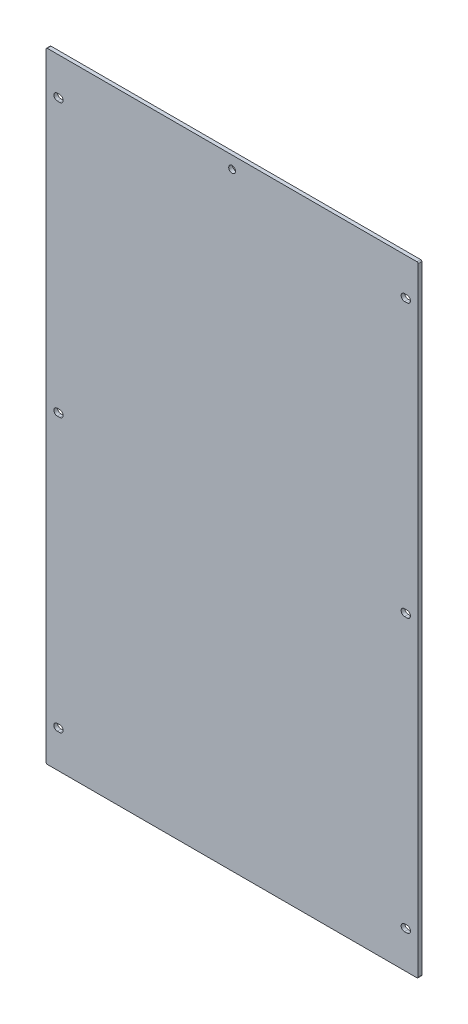
ISO-10303-21;
HEADER;
FILE_DESCRIPTION(('STEP AP214'),'2;1');
FILE_NAME('part.step','',(''),(''),'','','');
FILE_SCHEMA(('AUTOMOTIVE_DESIGN { 1 0 10303 214 1 1 1 1 }'));
ENDSEC;
DATA;
#1=APPLICATION_CONTEXT('core data for automotive mechanical design processes');
#2=APPLICATION_PROTOCOL_DEFINITION('international standard','automotive_design',2000,#1);
#3=PRODUCT_CONTEXT('',#1,'mechanical');
#4=PRODUCT('Part','Part','',(#3));
#5=PRODUCT_RELATED_PRODUCT_CATEGORY('part','',(#4));
#6=PRODUCT_DEFINITION_FORMATION('','',#4);
#7=PRODUCT_DEFINITION_CONTEXT('part definition',#1,'design');
#8=PRODUCT_DEFINITION('design','',#6,#7);
#9=PRODUCT_DEFINITION_SHAPE('','',#8);
#10=(LENGTH_UNIT() NAMED_UNIT(*) SI_UNIT(.MILLI.,.METRE.));
#11=(NAMED_UNIT(*) PLANE_ANGLE_UNIT() SI_UNIT($,.RADIAN.));
#12=(NAMED_UNIT(*) SI_UNIT($,.STERADIAN.) SOLID_ANGLE_UNIT());
#13=UNCERTAINTY_MEASURE_WITH_UNIT(LENGTH_MEASURE(1.E-05),#10,'distance_accuracy_value','');
#14=(GEOMETRIC_REPRESENTATION_CONTEXT(3) GLOBAL_UNCERTAINTY_ASSIGNED_CONTEXT((#13)) GLOBAL_UNIT_ASSIGNED_CONTEXT((#10,
#11,#12)) REPRESENTATION_CONTEXT('',''));
#15=CARTESIAN_POINT('',(0.,0.,0.));
#16=DIRECTION('',(0.,0.,1.));
#17=DIRECTION('',(1.,0.,0.));
#18=AXIS2_PLACEMENT_3D('',#15,#16,#17);
#19=CARTESIAN_POINT('',(0.,0.,3.));
#20=DIRECTION('',(0.,0.,1.));
#21=DIRECTION('',(1.,0.,0.));
#22=AXIS2_PLACEMENT_3D('',#19,#20,#21);
#23=PLANE('',#22);
#24=CARTESIAN_POINT('',(-141.,-220.,3.));
#25=DIRECTION('',(0.,0.,1.));
#26=DIRECTION('',(1.,0.,0.));
#27=AXIS2_PLACEMENT_3D('',#24,#25,#26);
#28=CIRCLE('',#27,2.74999999999997);
#29=CARTESIAN_POINT('',(-141.,-217.25,3.));
#30=VERTEX_POINT('',#29);
#31=CARTESIAN_POINT('',(-141.,-222.75,3.));
#32=VERTEX_POINT('',#31);
#33=EDGE_CURVE('E322',#30,#32,#28,.T.);
#34=ORIENTED_EDGE('',*,*,#33,.F.);
#35=DIRECTION('',(-1.,0.,0.));
#36=VECTOR('',#35,1.);
#37=CARTESIAN_POINT('',(-141.,-217.25,3.));
#38=LINE('',#37,#36);
#39=CARTESIAN_POINT('',(-139.,-217.25,3.));
#40=VERTEX_POINT('',#39);
#41=EDGE_CURVE('E331',#40,#30,#38,.T.);
#42=ORIENTED_EDGE('',*,*,#41,.F.);
#43=CARTESIAN_POINT('',(-139.,-220.,3.));
#44=DIRECTION('',(0.,0.,1.));
#45=DIRECTION('',(1.,0.,0.));
#46=AXIS2_PLACEMENT_3D('',#43,#44,#45);
#47=CIRCLE('',#46,2.74999999999997);
#48=CARTESIAN_POINT('',(-139.,-222.75,3.));
#49=VERTEX_POINT('',#48);
#50=EDGE_CURVE('E328',#49,#40,#47,.T.);
#51=ORIENTED_EDGE('',*,*,#50,.F.);
#52=DIRECTION('',(1.,0.,0.));
#53=VECTOR('',#52,1.);
#54=CARTESIAN_POINT('',(-141.,-222.75,3.));
#55=LINE('',#54,#53);
#56=EDGE_CURVE('E324',#32,#49,#55,.T.);
#57=ORIENTED_EDGE('',*,*,#56,.F.);
#58=EDGE_LOOP('',(#34,#42,#51,#57));
#59=FACE_BOUND('',#58,.T.);
#60=CARTESIAN_POINT('',(-141.,220.,3.));
#61=DIRECTION('',(0.,0.,1.));
#62=DIRECTION('',(1.,0.,0.));
#63=AXIS2_PLACEMENT_3D('',#60,#61,#62);
#64=CIRCLE('',#63,2.75);
#65=CARTESIAN_POINT('',(-141.,222.75,3.));
#66=VERTEX_POINT('',#65);
#67=CARTESIAN_POINT('',(-141.,217.25,3.));
#68=VERTEX_POINT('',#67);
#69=EDGE_CURVE('E325',#66,#68,#64,.T.);
#70=ORIENTED_EDGE('',*,*,#69,.F.);
#71=DIRECTION('',(-1.,0.,0.));
#72=VECTOR('',#71,1.);
#73=CARTESIAN_POINT('',(-141.,222.75,3.));
#74=LINE('',#73,#72);
#75=CARTESIAN_POINT('',(-139.,222.75,3.));
#76=VERTEX_POINT('',#75);
#77=EDGE_CURVE('E347',#76,#66,#74,.T.);
#78=ORIENTED_EDGE('',*,*,#77,.F.);
#79=CARTESIAN_POINT('',(-139.,220.,3.));
#80=DIRECTION('',(0.,0.,1.));
#81=DIRECTION('',(1.,0.,0.));
#82=AXIS2_PLACEMENT_3D('',#79,#80,#81);
#83=CIRCLE('',#82,2.75);
#84=CARTESIAN_POINT('',(-139.,217.25,3.));
#85=VERTEX_POINT('',#84);
#86=EDGE_CURVE('E357',#85,#76,#83,.T.);
#87=ORIENTED_EDGE('',*,*,#86,.F.);
#88=DIRECTION('',(1.,0.,0.));
#89=VECTOR('',#88,1.);
#90=CARTESIAN_POINT('',(-141.,217.25,3.));
#91=LINE('',#90,#89);
#92=EDGE_CURVE('E360',#68,#85,#91,.T.);
#93=ORIENTED_EDGE('',*,*,#92,.F.);
#94=EDGE_LOOP('',(#70,#78,#87,#93));
#95=FACE_BOUND('',#94,.T.);
#96=CARTESIAN_POINT('',(-141.,-1.11022302462516E-13,3.));
#97=DIRECTION('',(0.,0.,1.));
#98=DIRECTION('',(1.,0.,0.));
#99=AXIS2_PLACEMENT_3D('',#96,#97,#98);
#100=CIRCLE('',#99,2.74999999999999);
#101=CARTESIAN_POINT('',(-141.,2.74999999999989,3.));
#102=VERTEX_POINT('',#101);
#103=CARTESIAN_POINT('',(-141.,-2.75000000000009,3.));
#104=VERTEX_POINT('',#103);
#105=EDGE_CURVE('E354',#102,#104,#100,.T.);
#106=ORIENTED_EDGE('',*,*,#105,.F.);
#107=DIRECTION('',(-1.,0.,0.));
#108=VECTOR('',#107,1.);
#109=CARTESIAN_POINT('',(-141.,2.74999999999989,3.));
#110=LINE('',#109,#108);
#111=CARTESIAN_POINT('',(-139.,2.74999999999989,3.));
#112=VERTEX_POINT('',#111);
#113=EDGE_CURVE('E367',#112,#102,#110,.T.);
#114=ORIENTED_EDGE('',*,*,#113,.F.);
#115=CARTESIAN_POINT('',(-139.,-1.10777373102686E-13,3.));
#116=DIRECTION('',(0.,0.,1.));
#117=DIRECTION('',(1.,0.,0.));
#118=AXIS2_PLACEMENT_3D('',#115,#116,#117);
#119=CIRCLE('',#118,2.74999999999999);
#120=CARTESIAN_POINT('',(-139.,-2.7500000000001,3.));
#121=VERTEX_POINT('',#120);
#122=EDGE_CURVE('E376',#121,#112,#119,.T.);
#123=ORIENTED_EDGE('',*,*,#122,.F.);
#124=DIRECTION('',(1.,0.,0.));
#125=VECTOR('',#124,1.);
#126=CARTESIAN_POINT('',(-141.,-2.75000000000009,3.));
#127=LINE('',#126,#125);
#128=EDGE_CURVE('E379',#104,#121,#127,.T.);
#129=ORIENTED_EDGE('',*,*,#128,.F.);
#130=EDGE_LOOP('',(#106,#114,#123,#129));
#131=FACE_BOUND('',#130,.T.);
#132=CARTESIAN_POINT('',(0.,240.,3.));
#133=DIRECTION('',(0.,0.,1.));
#134=DIRECTION('',(1.,0.,0.));
#135=AXIS2_PLACEMENT_3D('',#132,#133,#134);
#136=CIRCLE('',#135,2.75);
#137=CARTESIAN_POINT('',(2.75,240.,3.));
#138=VERTEX_POINT('',#137);
#139=EDGE_CURVE('E277',#138,#138,#136,.T.);
#140=ORIENTED_EDGE('',*,*,#139,.F.);
#141=EDGE_LOOP('',(#140));
#142=FACE_BOUND('',#141,.T.);
#143=DIRECTION('',(-1.,0.,0.));
#144=VECTOR('',#143,1.);
#145=CARTESIAN_POINT('',(150.,250.,3.));
#146=LINE('',#145,#144);
#147=CARTESIAN_POINT('',(149.,250.,3.));
#148=VERTEX_POINT('',#147);
#149=CARTESIAN_POINT('',(-149.,250.,3.));
#150=VERTEX_POINT('',#149);
#151=EDGE_CURVE('E393',#148,#150,#146,.T.);
#152=ORIENTED_EDGE('',*,*,#151,.T.);
#153=CARTESIAN_POINT('',(-149.,249.,3.));
#154=DIRECTION('',(0.,0.,1.));
#155=DIRECTION('',(1.,0.,0.));
#156=AXIS2_PLACEMENT_3D('',#153,#154,#155);
#157=CIRCLE('',#156,1.);
#158=CARTESIAN_POINT('',(-150.,249.,3.));
#159=VERTEX_POINT('',#158);
#160=EDGE_CURVE('E492',#150,#159,#157,.T.);
#161=ORIENTED_EDGE('',*,*,#160,.T.);
#162=DIRECTION('',(0.,-1.,0.));
#163=VECTOR('',#162,1.);
#164=CARTESIAN_POINT('',(-150.,-250.,3.));
#165=LINE('',#164,#163);
#166=CARTESIAN_POINT('',(-150.,-249.,3.));
#167=VERTEX_POINT('',#166);
#168=EDGE_CURVE('E385',#159,#167,#165,.T.);
#169=ORIENTED_EDGE('',*,*,#168,.T.);
#170=CARTESIAN_POINT('',(-149.,-249.,3.));
#171=DIRECTION('',(0.,0.,1.));
#172=DIRECTION('',(1.,0.,0.));
#173=AXIS2_PLACEMENT_3D('',#170,#171,#172);
#174=CIRCLE('',#173,1.);
#175=CARTESIAN_POINT('',(-149.,-250.,3.));
#176=VERTEX_POINT('',#175);
#177=EDGE_CURVE('E489',#167,#176,#174,.T.);
#178=ORIENTED_EDGE('',*,*,#177,.T.);
#179=DIRECTION('',(1.,0.,0.));
#180=VECTOR('',#179,1.);
#181=CARTESIAN_POINT('',(150.,-250.,3.));
#182=LINE('',#181,#180);
#183=CARTESIAN_POINT('',(149.,-250.,3.));
#184=VERTEX_POINT('',#183);
#185=EDGE_CURVE('E388',#176,#184,#182,.T.);
#186=ORIENTED_EDGE('',*,*,#185,.T.);
#187=CARTESIAN_POINT('',(149.,-249.,3.));
#188=DIRECTION('',(0.,0.,1.));
#189=DIRECTION('',(1.,0.,0.));
#190=AXIS2_PLACEMENT_3D('',#187,#188,#189);
#191=CIRCLE('',#190,1.);
#192=CARTESIAN_POINT('',(150.,-249.,3.));
#193=VERTEX_POINT('',#192);
#194=EDGE_CURVE('E58',#184,#193,#191,.T.);
#195=ORIENTED_EDGE('',*,*,#194,.T.);
#196=DIRECTION('',(0.,1.,0.));
#197=VECTOR('',#196,1.);
#198=CARTESIAN_POINT('',(150.,-250.,3.));
#199=LINE('',#198,#197);
#200=CARTESIAN_POINT('',(150.,249.,3.));
#201=VERTEX_POINT('',#200);
#202=EDGE_CURVE('E391',#193,#201,#199,.T.);
#203=ORIENTED_EDGE('',*,*,#202,.T.);
#204=CARTESIAN_POINT('',(149.,249.,3.));
#205=DIRECTION('',(0.,0.,1.));
#206=DIRECTION('',(1.,0.,0.));
#207=AXIS2_PLACEMENT_3D('',#204,#205,#206);
#208=CIRCLE('',#207,1.);
#209=EDGE_CURVE('E487',#201,#148,#208,.T.);
#210=ORIENTED_EDGE('',*,*,#209,.T.);
#211=EDGE_LOOP('',(#152,#161,#169,#178,#186,#195,#203,#210));
#212=FACE_BOUND('',#211,.T.);
#213=DIRECTION('',(1.,0.,0.));
#214=VECTOR('',#213,1.);
#215=CARTESIAN_POINT('',(141.,2.74999999999989,3.));
#216=LINE('',#215,#214);
#217=CARTESIAN_POINT('',(139.,2.74999999999989,3.));
#218=VERTEX_POINT('',#217);
#219=CARTESIAN_POINT('',(141.,2.74999999999989,3.));
#220=VERTEX_POINT('',#219);
#221=EDGE_CURVE('E305',#218,#220,#216,.T.);
#222=ORIENTED_EDGE('',*,*,#221,.T.);
#223=CARTESIAN_POINT('',(141.,-1.11022302462516E-13,3.));
#224=DIRECTION('',(0.,0.,-1.));
#225=DIRECTION('',(-1.,0.,0.));
#226=AXIS2_PLACEMENT_3D('',#223,#224,#225);
#227=CIRCLE('',#226,2.74999999999999);
#228=CARTESIAN_POINT('',(141.,-2.75000000000009,3.));
#229=VERTEX_POINT('',#228);
#230=EDGE_CURVE('E302',#220,#229,#227,.T.);
#231=ORIENTED_EDGE('',*,*,#230,.T.);
#232=DIRECTION('',(-1.,0.,0.));
#233=VECTOR('',#232,1.);
#234=CARTESIAN_POINT('',(141.,-2.75000000000009,3.));
#235=LINE('',#234,#233);
#236=CARTESIAN_POINT('',(139.,-2.7500000000001,3.));
#237=VERTEX_POINT('',#236);
#238=EDGE_CURVE('E311',#229,#237,#235,.T.);
#239=ORIENTED_EDGE('',*,*,#238,.T.);
#240=CARTESIAN_POINT('',(139.,-1.10777373102686E-13,3.));
#241=DIRECTION('',(0.,0.,-1.));
#242=DIRECTION('',(-1.,0.,0.));
#243=AXIS2_PLACEMENT_3D('',#240,#241,#242);
#244=CIRCLE('',#243,2.74999999999999);
#245=EDGE_CURVE('E308',#237,#218,#244,.T.);
#246=ORIENTED_EDGE('',*,*,#245,.T.);
#247=EDGE_LOOP('',(#222,#231,#239,#246));
#248=FACE_BOUND('',#247,.T.);
#249=DIRECTION('',(1.,0.,0.));
#250=VECTOR('',#249,1.);
#251=CARTESIAN_POINT('',(141.,222.75,3.));
#252=LINE('',#251,#250);
#253=CARTESIAN_POINT('',(139.,222.75,3.));
#254=VERTEX_POINT('',#253);
#255=CARTESIAN_POINT('',(141.,222.75,3.));
#256=VERTEX_POINT('',#255);
#257=EDGE_CURVE('E283',#254,#256,#252,.T.);
#258=ORIENTED_EDGE('',*,*,#257,.T.);
#259=CARTESIAN_POINT('',(141.,220.,3.));
#260=DIRECTION('',(0.,0.,-1.));
#261=DIRECTION('',(-1.,0.,0.));
#262=AXIS2_PLACEMENT_3D('',#259,#260,#261);
#263=CIRCLE('',#262,2.75);
#264=CARTESIAN_POINT('',(141.,217.25,3.));
#265=VERTEX_POINT('',#264);
#266=EDGE_CURVE('E280',#256,#265,#263,.T.);
#267=ORIENTED_EDGE('',*,*,#266,.T.);
#268=DIRECTION('',(-1.,0.,0.));
#269=VECTOR('',#268,1.);
#270=CARTESIAN_POINT('',(141.,217.25,3.));
#271=LINE('',#270,#269);
#272=CARTESIAN_POINT('',(139.,217.25,3.));
#273=VERTEX_POINT('',#272);
#274=EDGE_CURVE('E290',#265,#273,#271,.T.);
#275=ORIENTED_EDGE('',*,*,#274,.T.);
#276=CARTESIAN_POINT('',(139.,220.,3.));
#277=DIRECTION('',(0.,0.,-1.));
#278=DIRECTION('',(-1.,0.,0.));
#279=AXIS2_PLACEMENT_3D('',#276,#277,#278);
#280=CIRCLE('',#279,2.75);
#281=EDGE_CURVE('E287',#273,#254,#280,.T.);
#282=ORIENTED_EDGE('',*,*,#281,.T.);
#283=EDGE_LOOP('',(#258,#267,#275,#282));
#284=FACE_BOUND('',#283,.T.);
#285=DIRECTION('',(1.,0.,0.));
#286=VECTOR('',#285,1.);
#287=CARTESIAN_POINT('',(141.,-217.25,3.));
#288=LINE('',#287,#286);
#289=CARTESIAN_POINT('',(139.,-217.25,3.));
#290=VERTEX_POINT('',#289);
#291=CARTESIAN_POINT('',(141.,-217.25,3.));
#292=VERTEX_POINT('',#291);
#293=EDGE_CURVE('E262',#290,#292,#288,.T.);
#294=ORIENTED_EDGE('',*,*,#293,.T.);
#295=CARTESIAN_POINT('',(141.,-220.,3.));
#296=DIRECTION('',(0.,0.,-1.));
#297=DIRECTION('',(-1.,0.,0.));
#298=AXIS2_PLACEMENT_3D('',#295,#296,#297);
#299=CIRCLE('',#298,2.74999999999997);
#300=CARTESIAN_POINT('',(141.,-222.75,3.));
#301=VERTEX_POINT('',#300);
#302=EDGE_CURVE('E267',#292,#301,#299,.T.);
#303=ORIENTED_EDGE('',*,*,#302,.T.);
#304=DIRECTION('',(-1.,0.,0.));
#305=VECTOR('',#304,1.);
#306=CARTESIAN_POINT('',(141.,-222.75,3.));
#307=LINE('',#306,#305);
#308=CARTESIAN_POINT('',(139.,-222.75,3.));
#309=VERTEX_POINT('',#308);
#310=EDGE_CURVE('E270',#301,#309,#307,.T.);
#311=ORIENTED_EDGE('',*,*,#310,.T.);
#312=CARTESIAN_POINT('',(139.,-220.,3.));
#313=DIRECTION('',(0.,0.,-1.));
#314=DIRECTION('',(-1.,0.,0.));
#315=AXIS2_PLACEMENT_3D('',#312,#313,#314);
#316=CIRCLE('',#315,2.74999999999997);
#317=EDGE_CURVE('E251',#309,#290,#316,.T.);
#318=ORIENTED_EDGE('',*,*,#317,.T.);
#319=EDGE_LOOP('',(#294,#303,#311,#318));
#320=FACE_BOUND('',#319,.T.);
#321=ADVANCED_FACE('F36',(#59,#95,#131,#142,#212,#248,#284,#320),#23,.T.);
#322=CARTESIAN_POINT('',(0.,0.,0.));
#323=DIRECTION('',(0.,0.,1.));
#324=DIRECTION('',(1.,0.,0.));
#325=AXIS2_PLACEMENT_3D('',#322,#323,#324);
#326=PLANE('',#325);
#327=CARTESIAN_POINT('',(141.,220.,0.));
#328=DIRECTION('',(0.,0.,1.));
#329=DIRECTION('',(1.,0.,0.));
#330=AXIS2_PLACEMENT_3D('',#327,#328,#329);
#331=CIRCLE('',#330,2.75);
#332=CARTESIAN_POINT('',(141.,222.75,0.));
#333=VERTEX_POINT('',#332);
#334=CARTESIAN_POINT('',(141.,217.25,0.));
#335=VERTEX_POINT('',#334);
#336=EDGE_CURVE('E460',#333,#335,#331,.F.);
#337=ORIENTED_EDGE('',*,*,#336,.F.);
#338=DIRECTION('',(1.,0.,0.));
#339=VECTOR('',#338,1.);
#340=CARTESIAN_POINT('',(0.,222.75,0.));
#341=LINE('',#340,#339);
#342=CARTESIAN_POINT('',(139.,222.75,0.));
#343=VERTEX_POINT('',#342);
#344=EDGE_CURVE('E453',#343,#333,#341,.T.);
#345=ORIENTED_EDGE('',*,*,#344,.F.);
#346=CARTESIAN_POINT('',(139.,220.,0.));
#347=DIRECTION('',(0.,0.,1.));
#348=DIRECTION('',(1.,0.,0.));
#349=AXIS2_PLACEMENT_3D('',#346,#347,#348);
#350=CIRCLE('',#349,2.75);
#351=CARTESIAN_POINT('',(139.,217.25,0.));
#352=VERTEX_POINT('',#351);
#353=EDGE_CURVE('E455',#352,#343,#350,.F.);
#354=ORIENTED_EDGE('',*,*,#353,.F.);
#355=DIRECTION('',(-1.,0.,0.));
#356=VECTOR('',#355,1.);
#357=CARTESIAN_POINT('',(0.,217.25,0.));
#358=LINE('',#357,#356);
#359=EDGE_CURVE('E458',#335,#352,#358,.T.);
#360=ORIENTED_EDGE('',*,*,#359,.F.);
#361=EDGE_LOOP('',(#337,#345,#354,#360));
#362=FACE_BOUND('',#361,.T.);
#363=DIRECTION('',(0.,-1.,0.));
#364=VECTOR('',#363,1.);
#365=CARTESIAN_POINT('',(-150.,-250.,0.));
#366=LINE('',#365,#364);
#367=CARTESIAN_POINT('',(-150.,249.,0.));
#368=VERTEX_POINT('',#367);
#369=CARTESIAN_POINT('',(-150.,-249.,0.));
#370=VERTEX_POINT('',#369);
#371=EDGE_CURVE('E397',#368,#370,#366,.T.);
#372=ORIENTED_EDGE('',*,*,#371,.F.);
#373=CARTESIAN_POINT('',(-149.,249.,0.));
#374=DIRECTION('',(0.,0.,1.));
#375=DIRECTION('',(1.,0.,0.));
#376=AXIS2_PLACEMENT_3D('',#373,#374,#375);
#377=CIRCLE('',#376,1.);
#378=CARTESIAN_POINT('',(-149.,250.,0.));
#379=VERTEX_POINT('',#378);
#380=EDGE_CURVE('E480',#368,#379,#377,.F.);
#381=ORIENTED_EDGE('',*,*,#380,.T.);
#382=DIRECTION('',(-1.,0.,0.));
#383=VECTOR('',#382,1.);
#384=CARTESIAN_POINT('',(150.,250.,0.));
#385=LINE('',#384,#383);
#386=CARTESIAN_POINT('',(149.,250.,0.));
#387=VERTEX_POINT('',#386);
#388=EDGE_CURVE('E389',#387,#379,#385,.T.);
#389=ORIENTED_EDGE('',*,*,#388,.F.);
#390=CARTESIAN_POINT('',(149.,249.,0.));
#391=DIRECTION('',(0.,0.,1.));
#392=DIRECTION('',(1.,0.,0.));
#393=AXIS2_PLACEMENT_3D('',#390,#391,#392);
#394=CIRCLE('',#393,1.);
#395=CARTESIAN_POINT('',(150.,249.,0.));
#396=VERTEX_POINT('',#395);
#397=EDGE_CURVE('E474',#387,#396,#394,.F.);
#398=ORIENTED_EDGE('',*,*,#397,.T.);
#399=DIRECTION('',(0.,1.,0.));
#400=VECTOR('',#399,1.);
#401=CARTESIAN_POINT('',(150.,-250.,0.));
#402=LINE('',#401,#400);
#403=CARTESIAN_POINT('',(150.,-249.,0.));
#404=VERTEX_POINT('',#403);
#405=EDGE_CURVE('E403',#404,#396,#402,.T.);
#406=ORIENTED_EDGE('',*,*,#405,.F.);
#407=CARTESIAN_POINT('',(149.,-249.,0.));
#408=DIRECTION('',(0.,0.,1.));
#409=DIRECTION('',(1.,0.,0.));
#410=AXIS2_PLACEMENT_3D('',#407,#408,#409);
#411=CIRCLE('',#410,1.);
#412=CARTESIAN_POINT('',(149.,-250.,0.));
#413=VERTEX_POINT('',#412);
#414=EDGE_CURVE('E478',#404,#413,#411,.F.);
#415=ORIENTED_EDGE('',*,*,#414,.T.);
#416=DIRECTION('',(1.,0.,0.));
#417=VECTOR('',#416,1.);
#418=CARTESIAN_POINT('',(150.,-250.,0.));
#419=LINE('',#418,#417);
#420=CARTESIAN_POINT('',(-149.,-250.,0.));
#421=VERTEX_POINT('',#420);
#422=EDGE_CURVE('E400',#421,#413,#419,.T.);
#423=ORIENTED_EDGE('',*,*,#422,.F.);
#424=CARTESIAN_POINT('',(-149.,-249.,0.));
#425=DIRECTION('',(0.,0.,1.));
#426=DIRECTION('',(1.,0.,0.));
#427=AXIS2_PLACEMENT_3D('',#424,#425,#426);
#428=CIRCLE('',#427,1.);
#429=EDGE_CURVE('E476',#421,#370,#428,.F.);
#430=ORIENTED_EDGE('',*,*,#429,.T.);
#431=EDGE_LOOP('',(#372,#381,#389,#398,#406,#415,#423,#430));
#432=FACE_BOUND('',#431,.T.);
#433=CARTESIAN_POINT('',(0.,240.,0.));
#434=DIRECTION('',(0.,0.,1.));
#435=DIRECTION('',(1.,0.,0.));
#436=AXIS2_PLACEMENT_3D('',#433,#434,#435);
#437=CIRCLE('',#436,2.75);
#438=CARTESIAN_POINT('',(2.75,240.,0.));
#439=VERTEX_POINT('',#438);
#440=EDGE_CURVE('E337',#439,#439,#437,.T.);
#441=ORIENTED_EDGE('',*,*,#440,.T.);
#442=EDGE_LOOP('',(#441));
#443=FACE_BOUND('',#442,.T.);
#444=DIRECTION('',(-1.,0.,0.));
#445=VECTOR('',#444,1.);
#446=CARTESIAN_POINT('',(0.,2.74999999999992,0.));
#447=LINE('',#446,#445);
#448=CARTESIAN_POINT('',(-139.,2.74999999999989,0.));
#449=VERTEX_POINT('',#448);
#450=CARTESIAN_POINT('',(-141.,2.74999999999989,0.));
#451=VERTEX_POINT('',#450);
#452=EDGE_CURVE('E414',#449,#451,#447,.T.);
#453=ORIENTED_EDGE('',*,*,#452,.T.);
#454=CARTESIAN_POINT('',(-141.,-1.11022302462516E-13,0.));
#455=DIRECTION('',(0.,0.,1.));
#456=DIRECTION('',(1.,0.,0.));
#457=AXIS2_PLACEMENT_3D('',#454,#455,#456);
#458=CIRCLE('',#457,2.74999999999999);
#459=CARTESIAN_POINT('',(-141.,-2.75000000000009,0.));
#460=VERTEX_POINT('',#459);
#461=EDGE_CURVE('E417',#451,#460,#458,.T.);
#462=ORIENTED_EDGE('',*,*,#461,.T.);
#463=DIRECTION('',(1.,0.,0.));
#464=VECTOR('',#463,1.);
#465=CARTESIAN_POINT('',(0.,-2.75000000000006,0.));
#466=LINE('',#465,#464);
#467=CARTESIAN_POINT('',(-139.,-2.75000000000009,0.));
#468=VERTEX_POINT('',#467);
#469=EDGE_CURVE('E396',#460,#468,#466,.T.);
#470=ORIENTED_EDGE('',*,*,#469,.T.);
#471=CARTESIAN_POINT('',(-139.,-1.10777373102686E-13,0.));
#472=DIRECTION('',(0.,0.,1.));
#473=DIRECTION('',(1.,0.,0.));
#474=AXIS2_PLACEMENT_3D('',#471,#472,#473);
#475=CIRCLE('',#474,2.74999999999999);
#476=EDGE_CURVE('E411',#468,#449,#475,.T.);
#477=ORIENTED_EDGE('',*,*,#476,.T.);
#478=EDGE_LOOP('',(#453,#462,#470,#477));
#479=FACE_BOUND('',#478,.T.);
#480=DIRECTION('',(-1.,0.,0.));
#481=VECTOR('',#480,1.);
#482=CARTESIAN_POINT('',(0.,222.75,0.));
#483=LINE('',#482,#481);
#484=CARTESIAN_POINT('',(-139.,222.75,0.));
#485=VERTEX_POINT('',#484);
#486=CARTESIAN_POINT('',(-141.,222.75,0.));
#487=VERTEX_POINT('',#486);
#488=EDGE_CURVE('E426',#485,#487,#483,.T.);
#489=ORIENTED_EDGE('',*,*,#488,.T.);
#490=CARTESIAN_POINT('',(-141.,220.,0.));
#491=DIRECTION('',(0.,0.,1.));
#492=DIRECTION('',(1.,0.,0.));
#493=AXIS2_PLACEMENT_3D('',#490,#491,#492);
#494=CIRCLE('',#493,2.75);
#495=CARTESIAN_POINT('',(-141.,217.25,0.));
#496=VERTEX_POINT('',#495);
#497=EDGE_CURVE('E429',#487,#496,#494,.T.);
#498=ORIENTED_EDGE('',*,*,#497,.T.);
#499=DIRECTION('',(1.,0.,0.));
#500=VECTOR('',#499,1.);
#501=CARTESIAN_POINT('',(0.,217.25,0.));
#502=LINE('',#501,#500);
#503=CARTESIAN_POINT('',(-139.,217.25,0.));
#504=VERTEX_POINT('',#503);
#505=EDGE_CURVE('E420',#496,#504,#502,.T.);
#506=ORIENTED_EDGE('',*,*,#505,.T.);
#507=CARTESIAN_POINT('',(-139.,220.,0.));
#508=DIRECTION('',(0.,0.,1.));
#509=DIRECTION('',(1.,0.,0.));
#510=AXIS2_PLACEMENT_3D('',#507,#508,#509);
#511=CIRCLE('',#510,2.75);
#512=EDGE_CURVE('E423',#504,#485,#511,.T.);
#513=ORIENTED_EDGE('',*,*,#512,.T.);
#514=EDGE_LOOP('',(#489,#498,#506,#513));
#515=FACE_BOUND('',#514,.T.);
#516=DIRECTION('',(-1.,0.,0.));
#517=VECTOR('',#516,1.);
#518=CARTESIAN_POINT('',(0.,-217.25,0.));
#519=LINE('',#518,#517);
#520=CARTESIAN_POINT('',(-139.,-217.25,0.));
#521=VERTEX_POINT('',#520);
#522=CARTESIAN_POINT('',(-141.,-217.25,0.));
#523=VERTEX_POINT('',#522);
#524=EDGE_CURVE('E438',#521,#523,#519,.T.);
#525=ORIENTED_EDGE('',*,*,#524,.T.);
#526=CARTESIAN_POINT('',(-141.,-220.,0.));
#527=DIRECTION('',(0.,0.,1.));
#528=DIRECTION('',(1.,0.,0.));
#529=AXIS2_PLACEMENT_3D('',#526,#527,#528);
#530=CIRCLE('',#529,2.74999999999997);
#531=CARTESIAN_POINT('',(-141.,-222.75,0.));
#532=VERTEX_POINT('',#531);
#533=EDGE_CURVE('E441',#523,#532,#530,.T.);
#534=ORIENTED_EDGE('',*,*,#533,.T.);
#535=DIRECTION('',(1.,0.,0.));
#536=VECTOR('',#535,1.);
#537=CARTESIAN_POINT('',(0.,-222.75,0.));
#538=LINE('',#537,#536);
#539=CARTESIAN_POINT('',(-139.,-222.75,0.));
#540=VERTEX_POINT('',#539);
#541=EDGE_CURVE('E432',#532,#540,#538,.T.);
#542=ORIENTED_EDGE('',*,*,#541,.T.);
#543=CARTESIAN_POINT('',(-139.,-220.,0.));
#544=DIRECTION('',(0.,0.,1.));
#545=DIRECTION('',(1.,0.,0.));
#546=AXIS2_PLACEMENT_3D('',#543,#544,#545);
#547=CIRCLE('',#546,2.74999999999997);
#548=EDGE_CURVE('E435',#540,#521,#547,.T.);
#549=ORIENTED_EDGE('',*,*,#548,.T.);
#550=EDGE_LOOP('',(#525,#534,#542,#549));
#551=FACE_BOUND('',#550,.T.);
#552=CARTESIAN_POINT('',(141.,-1.11022302462516E-13,0.));
#553=DIRECTION('',(0.,0.,1.));
#554=DIRECTION('',(1.,0.,0.));
#555=AXIS2_PLACEMENT_3D('',#552,#553,#554);
#556=CIRCLE('',#555,2.74999999999999);
#557=CARTESIAN_POINT('',(141.,2.74999999999989,0.));
#558=VERTEX_POINT('',#557);
#559=CARTESIAN_POINT('',(141.,-2.75000000000009,0.));
#560=VERTEX_POINT('',#559);
#561=EDGE_CURVE('E451',#558,#560,#556,.F.);
#562=ORIENTED_EDGE('',*,*,#561,.F.);
#563=DIRECTION('',(1.,0.,0.));
#564=VECTOR('',#563,1.);
#565=CARTESIAN_POINT('',(0.,2.74999999999992,0.));
#566=LINE('',#565,#564);
#567=CARTESIAN_POINT('',(139.,2.74999999999989,0.));
#568=VERTEX_POINT('',#567);
#569=EDGE_CURVE('E444',#568,#558,#566,.T.);
#570=ORIENTED_EDGE('',*,*,#569,.F.);
#571=CARTESIAN_POINT('',(139.,-1.10777373102686E-13,0.));
#572=DIRECTION('',(0.,0.,1.));
#573=DIRECTION('',(1.,0.,0.));
#574=AXIS2_PLACEMENT_3D('',#571,#572,#573);
#575=CIRCLE('',#574,2.74999999999999);
#576=CARTESIAN_POINT('',(139.,-2.7500000000001,0.));
#577=VERTEX_POINT('',#576);
#578=EDGE_CURVE('E446',#577,#568,#575,.F.);
#579=ORIENTED_EDGE('',*,*,#578,.F.);
#580=DIRECTION('',(-1.,0.,0.));
#581=VECTOR('',#580,1.);
#582=CARTESIAN_POINT('',(0.,-2.75000000000006,0.));
#583=LINE('',#582,#581);
#584=EDGE_CURVE('E449',#560,#577,#583,.T.);
#585=ORIENTED_EDGE('',*,*,#584,.F.);
#586=EDGE_LOOP('',(#562,#570,#579,#585));
#587=FACE_BOUND('',#586,.T.);
#588=CARTESIAN_POINT('',(141.,-220.,0.));
#589=DIRECTION('',(0.,0.,1.));
#590=DIRECTION('',(1.,0.,0.));
#591=AXIS2_PLACEMENT_3D('',#588,#589,#590);
#592=CIRCLE('',#591,2.74999999999997);
#593=CARTESIAN_POINT('',(141.,-217.25,0.));
#594=VERTEX_POINT('',#593);
#595=CARTESIAN_POINT('',(141.,-222.75,0.));
#596=VERTEX_POINT('',#595);
#597=EDGE_CURVE('E467',#594,#596,#592,.F.);
#598=ORIENTED_EDGE('',*,*,#597,.F.);
#599=DIRECTION('',(1.,0.,0.));
#600=VECTOR('',#599,1.);
#601=CARTESIAN_POINT('',(0.,-217.25,0.));
#602=LINE('',#601,#600);
#603=CARTESIAN_POINT('',(139.,-217.25,0.));
#604=VERTEX_POINT('',#603);
#605=EDGE_CURVE('E462',#604,#594,#602,.T.);
#606=ORIENTED_EDGE('',*,*,#605,.F.);
#607=CARTESIAN_POINT('',(139.,-220.,0.));
#608=DIRECTION('',(0.,0.,1.));
#609=DIRECTION('',(1.,0.,0.));
#610=AXIS2_PLACEMENT_3D('',#607,#608,#609);
#611=CIRCLE('',#610,2.74999999999997);
#612=CARTESIAN_POINT('',(139.,-222.75,0.));
#613=VERTEX_POINT('',#612);
#614=EDGE_CURVE('E254',#613,#604,#611,.F.);
#615=ORIENTED_EDGE('',*,*,#614,.F.);
#616=DIRECTION('',(-1.,0.,0.));
#617=VECTOR('',#616,1.);
#618=CARTESIAN_POINT('',(0.,-222.75,0.));
#619=LINE('',#618,#617);
#620=EDGE_CURVE('E465',#596,#613,#619,.T.);
#621=ORIENTED_EDGE('',*,*,#620,.F.);
#622=EDGE_LOOP('',(#598,#606,#615,#621));
#623=FACE_BOUND('',#622,.T.);
#624=ADVANCED_FACE('F508',(#362,#432,#443,#479,#515,#551,#587,#623),#326,.F.);
#625=CARTESIAN_POINT('',(-150.,-250.,3.));
#626=DIRECTION('',(1.,0.,0.));
#627=DIRECTION('',(0.,0.,-1.));
#628=AXIS2_PLACEMENT_3D('',#625,#626,#627);
#629=PLANE('',#628);
#630=ORIENTED_EDGE('',*,*,#168,.F.);
#631=DIRECTION('',(0.,0.,-1.));
#632=VECTOR('',#631,1.);
#633=CARTESIAN_POINT('',(-150.,249.,3.));
#634=LINE('',#633,#632);
#635=EDGE_CURVE('E471',#159,#368,#634,.T.);
#636=ORIENTED_EDGE('',*,*,#635,.T.);
#637=ORIENTED_EDGE('',*,*,#371,.T.);
#638=DIRECTION('',(0.,0.,-1.));
#639=VECTOR('',#638,1.);
#640=CARTESIAN_POINT('',(-150.,-249.,3.));
#641=LINE('',#640,#639);
#642=EDGE_CURVE('E469',#370,#167,#641,.F.);
#643=ORIENTED_EDGE('',*,*,#642,.T.);
#644=EDGE_LOOP('',(#630,#636,#637,#643));
#645=FACE_BOUND('',#644,.T.);
#646=ADVANCED_FACE('F530',(#645),#629,.F.);
#647=CARTESIAN_POINT('',(150.,-250.,3.));
#648=DIRECTION('',(0.,1.,0.));
#649=DIRECTION('',(-1.,0.,0.));
#650=AXIS2_PLACEMENT_3D('',#647,#648,#649);
#651=PLANE('',#650);
#652=ORIENTED_EDGE('',*,*,#422,.T.);
#653=DIRECTION('',(0.,0.,-1.));
#654=VECTOR('',#653,1.);
#655=CARTESIAN_POINT('',(149.,-250.,3.));
#656=LINE('',#655,#654);
#657=EDGE_CURVE('E11',#413,#184,#656,.F.);
#658=ORIENTED_EDGE('',*,*,#657,.T.);
#659=ORIENTED_EDGE('',*,*,#185,.F.);
#660=DIRECTION('',(0.,0.,-1.));
#661=VECTOR('',#660,1.);
#662=CARTESIAN_POINT('',(-149.,-250.,3.));
#663=LINE('',#662,#661);
#664=EDGE_CURVE('E44',#176,#421,#663,.T.);
#665=ORIENTED_EDGE('',*,*,#664,.T.);
#666=EDGE_LOOP('',(#652,#658,#659,#665));
#667=FACE_BOUND('',#666,.T.);
#668=ADVANCED_FACE('F502',(#667),#651,.F.);
#669=CARTESIAN_POINT('',(150.,-250.,3.));
#670=DIRECTION('',(-1.,0.,0.));
#671=DIRECTION('',(0.,0.,1.));
#672=AXIS2_PLACEMENT_3D('',#669,#670,#671);
#673=PLANE('',#672);
#674=ORIENTED_EDGE('',*,*,#202,.F.);
#675=DIRECTION('',(0.,0.,-1.));
#676=VECTOR('',#675,1.);
#677=CARTESIAN_POINT('',(150.,-249.,3.));
#678=LINE('',#677,#676);
#679=EDGE_CURVE('E495',#193,#404,#678,.T.);
#680=ORIENTED_EDGE('',*,*,#679,.T.);
#681=ORIENTED_EDGE('',*,*,#405,.T.);
#682=DIRECTION('',(0.,0.,-1.));
#683=VECTOR('',#682,1.);
#684=CARTESIAN_POINT('',(150.,249.,3.));
#685=LINE('',#684,#683);
#686=EDGE_CURVE('E51',#396,#201,#685,.F.);
#687=ORIENTED_EDGE('',*,*,#686,.T.);
#688=EDGE_LOOP('',(#674,#680,#681,#687));
#689=FACE_BOUND('',#688,.T.);
#690=ADVANCED_FACE('F514',(#689),#673,.F.);
#691=CARTESIAN_POINT('',(150.,250.,3.));
#692=DIRECTION('',(0.,-1.,0.));
#693=DIRECTION('',(1.,0.,0.));
#694=AXIS2_PLACEMENT_3D('',#691,#692,#693);
#695=PLANE('',#694);
#696=ORIENTED_EDGE('',*,*,#388,.T.);
#697=DIRECTION('',(0.,0.,-1.));
#698=VECTOR('',#697,1.);
#699=CARTESIAN_POINT('',(-149.,250.,3.));
#700=LINE('',#699,#698);
#701=EDGE_CURVE('E485',#379,#150,#700,.F.);
#702=ORIENTED_EDGE('',*,*,#701,.T.);
#703=ORIENTED_EDGE('',*,*,#151,.F.);
#704=DIRECTION('',(0.,0.,-1.));
#705=VECTOR('',#704,1.);
#706=CARTESIAN_POINT('',(149.,250.,3.));
#707=LINE('',#706,#705);
#708=EDGE_CURVE('E482',#148,#387,#707,.T.);
#709=ORIENTED_EDGE('',*,*,#708,.T.);
#710=EDGE_LOOP('',(#696,#702,#703,#709));
#711=FACE_BOUND('',#710,.T.);
#712=ADVANCED_FACE('F522',(#711),#695,.F.);
#713=CARTESIAN_POINT('',(0.,240.,-7.));
#714=DIRECTION('',(0.,0.,1.));
#715=DIRECTION('',(1.,0.,0.));
#716=AXIS2_PLACEMENT_3D('',#713,#714,#715);
#717=CYLINDRICAL_SURFACE('',#716,2.75);
#718=ORIENTED_EDGE('',*,*,#139,.T.);
#719=EDGE_LOOP('',(#718));
#720=FACE_BOUND('',#719,.T.);
#721=ORIENTED_EDGE('',*,*,#440,.F.);
#722=EDGE_LOOP('',(#721));
#723=FACE_BOUND('',#722,.T.);
#724=ADVANCED_FACE('F550',(#720,#723),#717,.F.);
#725=CARTESIAN_POINT('',(-141.,-1.11022302462516E-13,-7.));
#726=DIRECTION('',(0.,0.,1.));
#727=DIRECTION('',(1.,0.,0.));
#728=AXIS2_PLACEMENT_3D('',#725,#726,#727);
#729=CYLINDRICAL_SURFACE('',#728,2.74999999999999);
#730=DIRECTION('',(0.,0.,1.));
#731=VECTOR('',#730,1.);
#732=CARTESIAN_POINT('',(-141.,2.74999999999989,-7.));
#733=LINE('',#732,#731);
#734=EDGE_CURVE('E372',#451,#102,#733,.T.);
#735=ORIENTED_EDGE('',*,*,#734,.T.);
#736=ORIENTED_EDGE('',*,*,#105,.T.);
#737=DIRECTION('',(0.,0.,1.));
#738=VECTOR('',#737,1.);
#739=CARTESIAN_POINT('',(-141.,-2.75000000000009,-7.));
#740=LINE('',#739,#738);
#741=EDGE_CURVE('E364',#460,#104,#740,.T.);
#742=ORIENTED_EDGE('',*,*,#741,.F.);
#743=ORIENTED_EDGE('',*,*,#461,.F.);
#744=EDGE_LOOP('',(#735,#736,#742,#743));
#745=FACE_BOUND('',#744,.T.);
#746=ADVANCED_FACE('F642',(#745),#729,.F.);
#747=CARTESIAN_POINT('',(-141.,2.74999999999989,-7.));
#748=DIRECTION('',(0.,1.,0.));
#749=DIRECTION('',(-1.,0.,0.));
#750=AXIS2_PLACEMENT_3D('',#747,#748,#749);
#751=PLANE('',#750);
#752=DIRECTION('',(0.,0.,1.));
#753=VECTOR('',#752,1.);
#754=CARTESIAN_POINT('',(-139.,2.74999999999989,-7.));
#755=LINE('',#754,#753);
#756=EDGE_CURVE('E370',#449,#112,#755,.T.);
#757=ORIENTED_EDGE('',*,*,#756,.T.);
#758=ORIENTED_EDGE('',*,*,#113,.T.);
#759=ORIENTED_EDGE('',*,*,#734,.F.);
#760=ORIENTED_EDGE('',*,*,#452,.F.);
#761=EDGE_LOOP('',(#757,#758,#759,#760));
#762=FACE_BOUND('',#761,.T.);
#763=ADVANCED_FACE('F645',(#762),#751,.F.);
#764=CARTESIAN_POINT('',(-139.,-1.10777373102686E-13,-7.));
#765=DIRECTION('',(0.,0.,1.));
#766=DIRECTION('',(1.,0.,0.));
#767=AXIS2_PLACEMENT_3D('',#764,#765,#766);
#768=CYLINDRICAL_SURFACE('',#767,2.74999999999999);
#769=DIRECTION('',(0.,0.,1.));
#770=VECTOR('',#769,1.);
#771=CARTESIAN_POINT('',(-139.,-2.7500000000001,-7.));
#772=LINE('',#771,#770);
#773=EDGE_CURVE('E368',#468,#121,#772,.T.);
#774=ORIENTED_EDGE('',*,*,#773,.T.);
#775=ORIENTED_EDGE('',*,*,#122,.T.);
#776=ORIENTED_EDGE('',*,*,#756,.F.);
#777=ORIENTED_EDGE('',*,*,#476,.F.);
#778=EDGE_LOOP('',(#774,#775,#776,#777));
#779=FACE_BOUND('',#778,.T.);
#780=ADVANCED_FACE('F649',(#779),#768,.F.);
#781=CARTESIAN_POINT('',(-141.,-2.75000000000009,-7.));
#782=DIRECTION('',(0.,-1.,0.));
#783=DIRECTION('',(1.,0.,0.));
#784=AXIS2_PLACEMENT_3D('',#781,#782,#783);
#785=PLANE('',#784);
#786=ORIENTED_EDGE('',*,*,#741,.T.);
#787=ORIENTED_EDGE('',*,*,#128,.T.);
#788=ORIENTED_EDGE('',*,*,#773,.F.);
#789=ORIENTED_EDGE('',*,*,#469,.F.);
#790=EDGE_LOOP('',(#786,#787,#788,#789));
#791=FACE_BOUND('',#790,.T.);
#792=ADVANCED_FACE('F630',(#791),#785,.F.);
#793=CARTESIAN_POINT('',(-141.,220.,-7.));
#794=DIRECTION('',(0.,0.,1.));
#795=DIRECTION('',(1.,0.,0.));
#796=AXIS2_PLACEMENT_3D('',#793,#794,#795);
#797=CYLINDRICAL_SURFACE('',#796,2.75);
#798=DIRECTION('',(0.,0.,1.));
#799=VECTOR('',#798,1.);
#800=CARTESIAN_POINT('',(-141.,222.75,-7.));
#801=LINE('',#800,#799);
#802=EDGE_CURVE('E352',#487,#66,#801,.T.);
#803=ORIENTED_EDGE('',*,*,#802,.T.);
#804=ORIENTED_EDGE('',*,*,#69,.T.);
#805=DIRECTION('',(0.,0.,1.));
#806=VECTOR('',#805,1.);
#807=CARTESIAN_POINT('',(-141.,217.25,-7.));
#808=LINE('',#807,#806);
#809=EDGE_CURVE('E344',#496,#68,#808,.T.);
#810=ORIENTED_EDGE('',*,*,#809,.F.);
#811=ORIENTED_EDGE('',*,*,#497,.F.);
#812=EDGE_LOOP('',(#803,#804,#810,#811));
#813=FACE_BOUND('',#812,.T.);
#814=ADVANCED_FACE('F626',(#813),#797,.F.);
#815=CARTESIAN_POINT('',(-141.,222.75,-7.));
#816=DIRECTION('',(0.,1.,0.));
#817=DIRECTION('',(0.,0.,1.));
#818=AXIS2_PLACEMENT_3D('',#815,#816,#817);
#819=PLANE('',#818);
#820=DIRECTION('',(0.,0.,1.));
#821=VECTOR('',#820,1.);
#822=CARTESIAN_POINT('',(-139.,222.75,-7.));
#823=LINE('',#822,#821);
#824=EDGE_CURVE('E350',#485,#76,#823,.T.);
#825=ORIENTED_EDGE('',*,*,#824,.T.);
#826=ORIENTED_EDGE('',*,*,#77,.T.);
#827=ORIENTED_EDGE('',*,*,#802,.F.);
#828=ORIENTED_EDGE('',*,*,#488,.F.);
#829=EDGE_LOOP('',(#825,#826,#827,#828));
#830=FACE_BOUND('',#829,.T.);
#831=ADVANCED_FACE('F629',(#830),#819,.F.);
#832=CARTESIAN_POINT('',(-139.,220.,-7.));
#833=DIRECTION('',(0.,0.,1.));
#834=DIRECTION('',(1.,0.,0.));
#835=AXIS2_PLACEMENT_3D('',#832,#833,#834);
#836=CYLINDRICAL_SURFACE('',#835,2.75);
#837=DIRECTION('',(0.,0.,1.));
#838=VECTOR('',#837,1.);
#839=CARTESIAN_POINT('',(-139.,217.25,-7.));
#840=LINE('',#839,#838);
#841=EDGE_CURVE('E348',#504,#85,#840,.T.);
#842=ORIENTED_EDGE('',*,*,#841,.T.);
#843=ORIENTED_EDGE('',*,*,#86,.T.);
#844=ORIENTED_EDGE('',*,*,#824,.F.);
#845=ORIENTED_EDGE('',*,*,#512,.F.);
#846=EDGE_LOOP('',(#842,#843,#844,#845));
#847=FACE_BOUND('',#846,.T.);
#848=ADVANCED_FACE('F634',(#847),#836,.F.);
#849=CARTESIAN_POINT('',(-141.,217.25,-7.));
#850=DIRECTION('',(0.,-1.,0.));
#851=DIRECTION('',(0.,0.,-1.));
#852=AXIS2_PLACEMENT_3D('',#849,#850,#851);
#853=PLANE('',#852);
#854=ORIENTED_EDGE('',*,*,#809,.T.);
#855=ORIENTED_EDGE('',*,*,#92,.T.);
#856=ORIENTED_EDGE('',*,*,#841,.F.);
#857=ORIENTED_EDGE('',*,*,#505,.F.);
#858=EDGE_LOOP('',(#854,#855,#856,#857));
#859=FACE_BOUND('',#858,.T.);
#860=ADVANCED_FACE('F624',(#859),#853,.F.);
#861=CARTESIAN_POINT('',(-141.,-220.,-7.));
#862=DIRECTION('',(0.,0.,1.));
#863=DIRECTION('',(1.,0.,0.));
#864=AXIS2_PLACEMENT_3D('',#861,#862,#863);
#865=CYLINDRICAL_SURFACE('',#864,2.74999999999997);
#866=DIRECTION('',(0.,0.,1.));
#867=VECTOR('',#866,1.);
#868=CARTESIAN_POINT('',(-141.,-217.25,-7.));
#869=LINE('',#868,#867);
#870=EDGE_CURVE('E335',#523,#30,#869,.T.);
#871=ORIENTED_EDGE('',*,*,#870,.T.);
#872=ORIENTED_EDGE('',*,*,#33,.T.);
#873=DIRECTION('',(0.,0.,1.));
#874=VECTOR('',#873,1.);
#875=CARTESIAN_POINT('',(-141.,-222.75,-7.));
#876=LINE('',#875,#874);
#877=EDGE_CURVE('E334',#532,#32,#876,.T.);
#878=ORIENTED_EDGE('',*,*,#877,.F.);
#879=ORIENTED_EDGE('',*,*,#533,.F.);
#880=EDGE_LOOP('',(#871,#872,#878,#879));
#881=FACE_BOUND('',#880,.T.);
#882=ADVANCED_FACE('F614',(#881),#865,.F.);
#883=CARTESIAN_POINT('',(-141.,-217.25,-7.));
#884=DIRECTION('',(0.,1.,0.));
#885=DIRECTION('',(0.,0.,1.));
#886=AXIS2_PLACEMENT_3D('',#883,#884,#885);
#887=PLANE('',#886);
#888=DIRECTION('',(0.,0.,1.));
#889=VECTOR('',#888,1.);
#890=CARTESIAN_POINT('',(-139.,-217.25,-7.));
#891=LINE('',#890,#889);
#892=EDGE_CURVE('E338',#521,#40,#891,.T.);
#893=ORIENTED_EDGE('',*,*,#892,.T.);
#894=ORIENTED_EDGE('',*,*,#41,.T.);
#895=ORIENTED_EDGE('',*,*,#870,.F.);
#896=ORIENTED_EDGE('',*,*,#524,.F.);
#897=EDGE_LOOP('',(#893,#894,#895,#896));
#898=FACE_BOUND('',#897,.T.);
#899=ADVANCED_FACE('F610',(#898),#887,.F.);
#900=CARTESIAN_POINT('',(-139.,-220.,-7.));
#901=DIRECTION('',(0.,0.,1.));
#902=DIRECTION('',(1.,0.,0.));
#903=AXIS2_PLACEMENT_3D('',#900,#901,#902);
#904=CYLINDRICAL_SURFACE('',#903,2.74999999999997);
#905=DIRECTION('',(0.,0.,1.));
#906=VECTOR('',#905,1.);
#907=CARTESIAN_POINT('',(-139.,-222.75,-7.));
#908=LINE('',#907,#906);
#909=EDGE_CURVE('E340',#540,#49,#908,.T.);
#910=ORIENTED_EDGE('',*,*,#909,.T.);
#911=ORIENTED_EDGE('',*,*,#50,.T.);
#912=ORIENTED_EDGE('',*,*,#892,.F.);
#913=ORIENTED_EDGE('',*,*,#548,.F.);
#914=EDGE_LOOP('',(#910,#911,#912,#913));
#915=FACE_BOUND('',#914,.T.);
#916=ADVANCED_FACE('F613',(#915),#904,.F.);
#917=CARTESIAN_POINT('',(-141.,-222.75,-7.));
#918=DIRECTION('',(0.,-1.,0.));
#919=DIRECTION('',(0.,0.,-1.));
#920=AXIS2_PLACEMENT_3D('',#917,#918,#919);
#921=PLANE('',#920);
#922=ORIENTED_EDGE('',*,*,#877,.T.);
#923=ORIENTED_EDGE('',*,*,#56,.T.);
#924=ORIENTED_EDGE('',*,*,#909,.F.);
#925=ORIENTED_EDGE('',*,*,#541,.F.);
#926=EDGE_LOOP('',(#922,#923,#924,#925));
#927=FACE_BOUND('',#926,.T.);
#928=ADVANCED_FACE('F608',(#927),#921,.F.);
#929=CARTESIAN_POINT('',(141.,-1.11022302462516E-13,-7.));
#930=DIRECTION('',(0.,0.,1.));
#931=DIRECTION('',(1.,0.,0.));
#932=AXIS2_PLACEMENT_3D('',#929,#930,#931);
#933=CYLINDRICAL_SURFACE('',#932,2.74999999999999);
#934=ORIENTED_EDGE('',*,*,#561,.T.);
#935=DIRECTION('',(0.,0.,1.));
#936=VECTOR('',#935,1.);
#937=CARTESIAN_POINT('',(141.,-2.75000000000009,-7.));
#938=LINE('',#937,#936);
#939=EDGE_CURVE('E284',#560,#229,#938,.T.);
#940=ORIENTED_EDGE('',*,*,#939,.T.);
#941=ORIENTED_EDGE('',*,*,#230,.F.);
#942=DIRECTION('',(0.,0.,1.));
#943=VECTOR('',#942,1.);
#944=CARTESIAN_POINT('',(141.,2.74999999999989,-7.));
#945=LINE('',#944,#943);
#946=EDGE_CURVE('E314',#558,#220,#945,.T.);
#947=ORIENTED_EDGE('',*,*,#946,.F.);
#948=EDGE_LOOP('',(#934,#940,#941,#947));
#949=FACE_BOUND('',#948,.T.);
#950=ADVANCED_FACE('F598',(#949),#933,.F.);
#951=CARTESIAN_POINT('',(141.,-2.75000000000009,-7.));
#952=DIRECTION('',(0.,1.,0.));
#953=DIRECTION('',(-1.,0.,0.));
#954=AXIS2_PLACEMENT_3D('',#951,#952,#953);
#955=PLANE('',#954);
#956=ORIENTED_EDGE('',*,*,#584,.T.);
#957=DIRECTION('',(0.,0.,1.));
#958=VECTOR('',#957,1.);
#959=CARTESIAN_POINT('',(139.,-2.7500000000001,-7.));
#960=LINE('',#959,#958);
#961=EDGE_CURVE('E316',#577,#237,#960,.T.);
#962=ORIENTED_EDGE('',*,*,#961,.T.);
#963=ORIENTED_EDGE('',*,*,#238,.F.);
#964=ORIENTED_EDGE('',*,*,#939,.F.);
#965=EDGE_LOOP('',(#956,#962,#963,#964));
#966=FACE_BOUND('',#965,.T.);
#967=ADVANCED_FACE('F594',(#966),#955,.T.);
#968=CARTESIAN_POINT('',(139.,-1.10777373102686E-13,-7.));
#969=DIRECTION('',(0.,0.,1.));
#970=DIRECTION('',(1.,0.,0.));
#971=AXIS2_PLACEMENT_3D('',#968,#969,#970);
#972=CYLINDRICAL_SURFACE('',#971,2.74999999999999);
#973=ORIENTED_EDGE('',*,*,#578,.T.);
#974=DIRECTION('',(0.,0.,1.));
#975=VECTOR('',#974,1.);
#976=CARTESIAN_POINT('',(139.,2.74999999999989,-7.));
#977=LINE('',#976,#975);
#978=EDGE_CURVE('E318',#568,#218,#977,.T.);
#979=ORIENTED_EDGE('',*,*,#978,.T.);
#980=ORIENTED_EDGE('',*,*,#245,.F.);
#981=ORIENTED_EDGE('',*,*,#961,.F.);
#982=EDGE_LOOP('',(#973,#979,#980,#981));
#983=FACE_BOUND('',#982,.T.);
#984=ADVANCED_FACE('F597',(#983),#972,.F.);
#985=CARTESIAN_POINT('',(141.,2.74999999999989,-7.));
#986=DIRECTION('',(0.,-1.,0.));
#987=DIRECTION('',(1.,0.,0.));
#988=AXIS2_PLACEMENT_3D('',#985,#986,#987);
#989=PLANE('',#988);
#990=ORIENTED_EDGE('',*,*,#569,.T.);
#991=ORIENTED_EDGE('',*,*,#946,.T.);
#992=ORIENTED_EDGE('',*,*,#221,.F.);
#993=ORIENTED_EDGE('',*,*,#978,.F.);
#994=EDGE_LOOP('',(#990,#991,#992,#993));
#995=FACE_BOUND('',#994,.T.);
#996=ADVANCED_FACE('F592',(#995),#989,.T.);
#997=CARTESIAN_POINT('',(141.,220.,-7.));
#998=DIRECTION('',(0.,0.,1.));
#999=DIRECTION('',(1.,0.,0.));
#1000=AXIS2_PLACEMENT_3D('',#997,#998,#999);
#1001=CYLINDRICAL_SURFACE('',#1000,2.75);
#1002=ORIENTED_EDGE('',*,*,#336,.T.);
#1003=DIRECTION('',(0.,0.,1.));
#1004=VECTOR('',#1003,1.);
#1005=CARTESIAN_POINT('',(141.,217.25,-7.));
#1006=LINE('',#1005,#1004);
#1007=EDGE_CURVE('E294',#335,#265,#1006,.T.);
#1008=ORIENTED_EDGE('',*,*,#1007,.T.);
#1009=ORIENTED_EDGE('',*,*,#266,.F.);
#1010=DIRECTION('',(0.,0.,1.));
#1011=VECTOR('',#1010,1.);
#1012=CARTESIAN_POINT('',(141.,222.75,-7.));
#1013=LINE('',#1012,#1011);
#1014=EDGE_CURVE('E293',#333,#256,#1013,.T.);
#1015=ORIENTED_EDGE('',*,*,#1014,.F.);
#1016=EDGE_LOOP('',(#1002,#1008,#1009,#1015));
#1017=FACE_BOUND('',#1016,.T.);
#1018=ADVANCED_FACE('F582',(#1017),#1001,.F.);
#1019=CARTESIAN_POINT('',(141.,217.25,-7.));
#1020=DIRECTION('',(0.,1.,0.));
#1021=DIRECTION('',(0.,0.,1.));
#1022=AXIS2_PLACEMENT_3D('',#1019,#1020,#1021);
#1023=PLANE('',#1022);
#1024=ORIENTED_EDGE('',*,*,#359,.T.);
#1025=DIRECTION('',(0.,0.,1.));
#1026=VECTOR('',#1025,1.);
#1027=CARTESIAN_POINT('',(139.,217.25,-7.));
#1028=LINE('',#1027,#1026);
#1029=EDGE_CURVE('E296',#352,#273,#1028,.T.);
#1030=ORIENTED_EDGE('',*,*,#1029,.T.);
#1031=ORIENTED_EDGE('',*,*,#274,.F.);
#1032=ORIENTED_EDGE('',*,*,#1007,.F.);
#1033=EDGE_LOOP('',(#1024,#1030,#1031,#1032));
#1034=FACE_BOUND('',#1033,.T.);
#1035=ADVANCED_FACE('F578',(#1034),#1023,.T.);
#1036=CARTESIAN_POINT('',(139.,220.,-7.));
#1037=DIRECTION('',(0.,0.,1.));
#1038=DIRECTION('',(1.,0.,0.));
#1039=AXIS2_PLACEMENT_3D('',#1036,#1037,#1038);
#1040=CYLINDRICAL_SURFACE('',#1039,2.75);
#1041=ORIENTED_EDGE('',*,*,#353,.T.);
#1042=DIRECTION('',(0.,0.,1.));
#1043=VECTOR('',#1042,1.);
#1044=CARTESIAN_POINT('',(139.,222.75,-7.));
#1045=LINE('',#1044,#1043);
#1046=EDGE_CURVE('E298',#343,#254,#1045,.T.);
#1047=ORIENTED_EDGE('',*,*,#1046,.T.);
#1048=ORIENTED_EDGE('',*,*,#281,.F.);
#1049=ORIENTED_EDGE('',*,*,#1029,.F.);
#1050=EDGE_LOOP('',(#1041,#1047,#1048,#1049));
#1051=FACE_BOUND('',#1050,.T.);
#1052=ADVANCED_FACE('F581',(#1051),#1040,.F.);
#1053=CARTESIAN_POINT('',(141.,222.75,-7.));
#1054=DIRECTION('',(0.,-1.,0.));
#1055=DIRECTION('',(0.,0.,-1.));
#1056=AXIS2_PLACEMENT_3D('',#1053,#1054,#1055);
#1057=PLANE('',#1056);
#1058=ORIENTED_EDGE('',*,*,#344,.T.);
#1059=ORIENTED_EDGE('',*,*,#1014,.T.);
#1060=ORIENTED_EDGE('',*,*,#257,.F.);
#1061=ORIENTED_EDGE('',*,*,#1046,.F.);
#1062=EDGE_LOOP('',(#1058,#1059,#1060,#1061));
#1063=FACE_BOUND('',#1062,.T.);
#1064=ADVANCED_FACE('F576',(#1063),#1057,.T.);
#1065=CARTESIAN_POINT('',(141.,-220.,-7.));
#1066=DIRECTION('',(0.,0.,1.));
#1067=DIRECTION('',(1.,0.,0.));
#1068=AXIS2_PLACEMENT_3D('',#1065,#1066,#1067);
#1069=CYLINDRICAL_SURFACE('',#1068,2.74999999999997);
#1070=ORIENTED_EDGE('',*,*,#597,.T.);
#1071=DIRECTION('',(0.,0.,1.));
#1072=VECTOR('',#1071,1.);
#1073=CARTESIAN_POINT('',(141.,-222.75,-7.));
#1074=LINE('',#1073,#1072);
#1075=EDGE_CURVE('E275',#596,#301,#1074,.T.);
#1076=ORIENTED_EDGE('',*,*,#1075,.T.);
#1077=ORIENTED_EDGE('',*,*,#302,.F.);
#1078=DIRECTION('',(0.,0.,1.));
#1079=VECTOR('',#1078,1.);
#1080=CARTESIAN_POINT('',(141.,-217.25,-7.));
#1081=LINE('',#1080,#1079);
#1082=EDGE_CURVE('E258',#594,#292,#1081,.T.);
#1083=ORIENTED_EDGE('',*,*,#1082,.F.);
#1084=EDGE_LOOP('',(#1070,#1076,#1077,#1083));
#1085=FACE_BOUND('',#1084,.T.);
#1086=ADVANCED_FACE('F573',(#1085),#1069,.F.);
#1087=CARTESIAN_POINT('',(141.,-222.75,-7.));
#1088=DIRECTION('',(0.,1.,0.));
#1089=DIRECTION('',(0.,0.,1.));
#1090=AXIS2_PLACEMENT_3D('',#1087,#1088,#1089);
#1091=PLANE('',#1090);
#1092=ORIENTED_EDGE('',*,*,#620,.T.);
#1093=DIRECTION('',(0.,0.,1.));
#1094=VECTOR('',#1093,1.);
#1095=CARTESIAN_POINT('',(139.,-222.75,-7.));
#1096=LINE('',#1095,#1094);
#1097=EDGE_CURVE('E257',#613,#309,#1096,.T.);
#1098=ORIENTED_EDGE('',*,*,#1097,.T.);
#1099=ORIENTED_EDGE('',*,*,#310,.F.);
#1100=ORIENTED_EDGE('',*,*,#1075,.F.);
#1101=EDGE_LOOP('',(#1092,#1098,#1099,#1100));
#1102=FACE_BOUND('',#1101,.T.);
#1103=ADVANCED_FACE('F569',(#1102),#1091,.T.);
#1104=CARTESIAN_POINT('',(139.,-220.,-7.));
#1105=DIRECTION('',(0.,0.,1.));
#1106=DIRECTION('',(1.,0.,0.));
#1107=AXIS2_PLACEMENT_3D('',#1104,#1105,#1106);
#1108=CYLINDRICAL_SURFACE('',#1107,2.74999999999997);
#1109=ORIENTED_EDGE('',*,*,#614,.T.);
#1110=DIRECTION('',(0.,0.,1.));
#1111=VECTOR('',#1110,1.);
#1112=CARTESIAN_POINT('',(139.,-217.25,-7.));
#1113=LINE('',#1112,#1111);
#1114=EDGE_CURVE('E246',#604,#290,#1113,.T.);
#1115=ORIENTED_EDGE('',*,*,#1114,.T.);
#1116=ORIENTED_EDGE('',*,*,#317,.F.);
#1117=ORIENTED_EDGE('',*,*,#1097,.F.);
#1118=EDGE_LOOP('',(#1109,#1115,#1116,#1117));
#1119=FACE_BOUND('',#1118,.T.);
#1120=ADVANCED_FACE('F248',(#1119),#1108,.F.);
#1121=CARTESIAN_POINT('',(141.,-217.25,-7.));
#1122=DIRECTION('',(0.,-1.,0.));
#1123=DIRECTION('',(0.,0.,-1.));
#1124=AXIS2_PLACEMENT_3D('',#1121,#1122,#1123);
#1125=PLANE('',#1124);
#1126=ORIENTED_EDGE('',*,*,#605,.T.);
#1127=ORIENTED_EDGE('',*,*,#1082,.T.);
#1128=ORIENTED_EDGE('',*,*,#293,.F.);
#1129=ORIENTED_EDGE('',*,*,#1114,.F.);
#1130=EDGE_LOOP('',(#1126,#1127,#1128,#1129));
#1131=FACE_BOUND('',#1130,.T.);
#1132=ADVANCED_FACE('F263',(#1131),#1125,.T.);
#1133=CARTESIAN_POINT('',(-149.,249.,3.));
#1134=DIRECTION('',(0.,0.,-1.));
#1135=DIRECTION('',(-1.,0.,0.));
#1136=AXIS2_PLACEMENT_3D('',#1133,#1134,#1135);
#1137=CYLINDRICAL_SURFACE('',#1136,1.);
#1138=ORIENTED_EDGE('',*,*,#160,.F.);
#1139=ORIENTED_EDGE('',*,*,#701,.F.);
#1140=ORIENTED_EDGE('',*,*,#380,.F.);
#1141=ORIENTED_EDGE('',*,*,#635,.F.);
#1142=EDGE_LOOP('',(#1138,#1139,#1140,#1141));
#1143=FACE_BOUND('',#1142,.T.);
#1144=ADVANCED_FACE('F527',(#1143),#1137,.T.);
#1145=CARTESIAN_POINT('',(149.,-249.,3.));
#1146=DIRECTION('',(0.,0.,-1.));
#1147=DIRECTION('',(-1.,0.,0.));
#1148=AXIS2_PLACEMENT_3D('',#1145,#1146,#1147);
#1149=CYLINDRICAL_SURFACE('',#1148,1.);
#1150=ORIENTED_EDGE('',*,*,#194,.F.);
#1151=ORIENTED_EDGE('',*,*,#657,.F.);
#1152=ORIENTED_EDGE('',*,*,#414,.F.);
#1153=ORIENTED_EDGE('',*,*,#679,.F.);
#1154=EDGE_LOOP('',(#1150,#1151,#1152,#1153));
#1155=FACE_BOUND('',#1154,.T.);
#1156=ADVANCED_FACE('F513',(#1155),#1149,.T.);
#1157=CARTESIAN_POINT('',(-149.,-249.,3.));
#1158=DIRECTION('',(0.,0.,-1.));
#1159=DIRECTION('',(-1.,0.,0.));
#1160=AXIS2_PLACEMENT_3D('',#1157,#1158,#1159);
#1161=CYLINDRICAL_SURFACE('',#1160,1.);
#1162=ORIENTED_EDGE('',*,*,#177,.F.);
#1163=ORIENTED_EDGE('',*,*,#642,.F.);
#1164=ORIENTED_EDGE('',*,*,#429,.F.);
#1165=ORIENTED_EDGE('',*,*,#664,.F.);
#1166=EDGE_LOOP('',(#1162,#1163,#1164,#1165));
#1167=FACE_BOUND('',#1166,.T.);
#1168=ADVANCED_FACE('F532',(#1167),#1161,.T.);
#1169=CARTESIAN_POINT('',(149.,249.,3.));
#1170=DIRECTION('',(0.,0.,-1.));
#1171=DIRECTION('',(-1.,0.,0.));
#1172=AXIS2_PLACEMENT_3D('',#1169,#1170,#1171);
#1173=CYLINDRICAL_SURFACE('',#1172,1.);
#1174=ORIENTED_EDGE('',*,*,#209,.F.);
#1175=ORIENTED_EDGE('',*,*,#686,.F.);
#1176=ORIENTED_EDGE('',*,*,#397,.F.);
#1177=ORIENTED_EDGE('',*,*,#708,.F.);
#1178=EDGE_LOOP('',(#1174,#1175,#1176,#1177));
#1179=FACE_BOUND('',#1178,.T.);
#1180=ADVANCED_FACE('F38',(#1179),#1173,.T.);
#1181=CLOSED_SHELL('',(#321,#624,#646,#668,#690,#712,#724,#746,#763,#780,#792,#814,#831,#848,
#860,#882,#899,#916,#928,#950,#967,#984,#996,#1018,#1035,#1052,#1064,#1086,#1103,#1120,#1132,
#1144,#1156,#1168,#1180));
#1182=MANIFOLD_SOLID_BREP('B2',#1181);
#1183=ADVANCED_BREP_SHAPE_REPRESENTATION('',(#18,#1182),#14);
#1184=SHAPE_DEFINITION_REPRESENTATION(#9,#1183);
ENDSEC;
END-ISO-10303-21;
